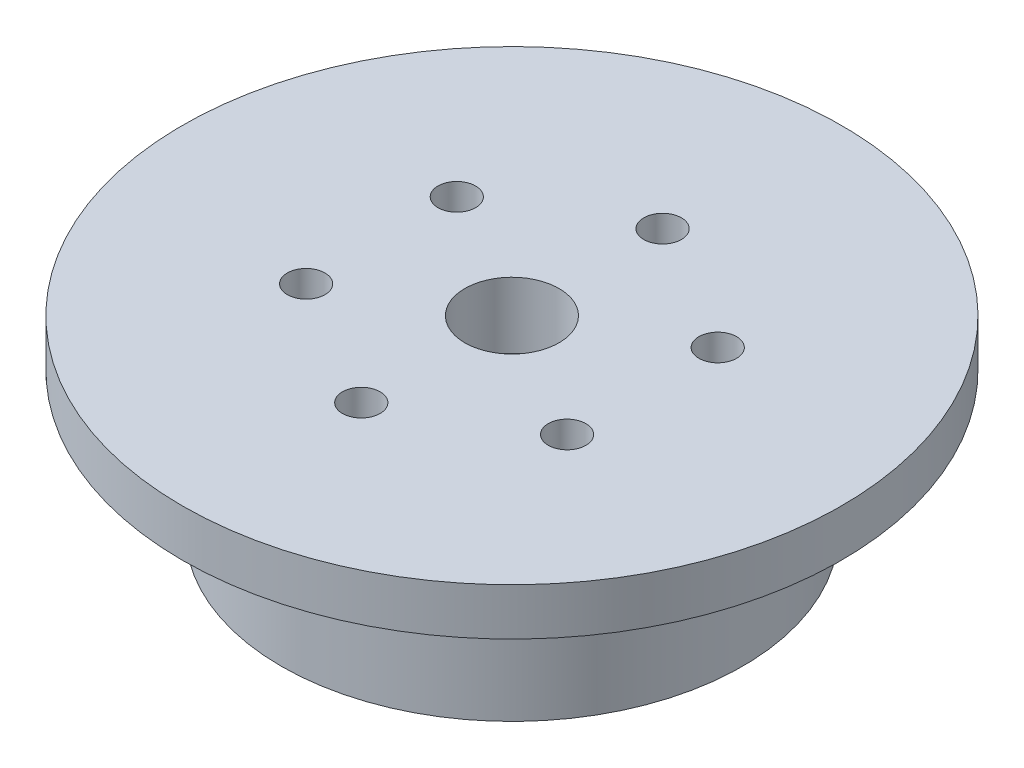
ISO-10303-21;
HEADER;
FILE_DESCRIPTION(('STEP AP214'),'2;1');
FILE_NAME('part.step','',(''),(''),'','','');
FILE_SCHEMA(('AUTOMOTIVE_DESIGN { 1 0 10303 214 1 1 1 1 }'));
ENDSEC;
DATA;
#1=APPLICATION_CONTEXT('core data for automotive mechanical design processes');
#2=APPLICATION_PROTOCOL_DEFINITION('international standard','automotive_design',2000,#1);
#3=PRODUCT_CONTEXT('',#1,'mechanical');
#4=PRODUCT('Part','Part','',(#3));
#5=PRODUCT_RELATED_PRODUCT_CATEGORY('part','',(#4));
#6=PRODUCT_DEFINITION_FORMATION('','',#4);
#7=PRODUCT_DEFINITION_CONTEXT('part definition',#1,'design');
#8=PRODUCT_DEFINITION('design','',#6,#7);
#9=PRODUCT_DEFINITION_SHAPE('','',#8);
#10=(LENGTH_UNIT() NAMED_UNIT(*) SI_UNIT(.MILLI.,.METRE.));
#11=(NAMED_UNIT(*) PLANE_ANGLE_UNIT() SI_UNIT($,.RADIAN.));
#12=(NAMED_UNIT(*) SI_UNIT($,.STERADIAN.) SOLID_ANGLE_UNIT());
#13=UNCERTAINTY_MEASURE_WITH_UNIT(LENGTH_MEASURE(1.E-05),#10,'distance_accuracy_value','');
#14=(GEOMETRIC_REPRESENTATION_CONTEXT(3) GLOBAL_UNCERTAINTY_ASSIGNED_CONTEXT((#13)) GLOBAL_UNIT_ASSIGNED_CONTEXT((#10,
#11,#12)) REPRESENTATION_CONTEXT('',''));
#15=CARTESIAN_POINT('',(0.,0.,0.));
#16=DIRECTION('',(0.,0.,1.));
#17=DIRECTION('',(1.,0.,0.));
#18=AXIS2_PLACEMENT_3D('',#15,#16,#17);
#19=CARTESIAN_POINT('',(0.,5.,0.));
#20=DIRECTION('',(0.,-1.,0.));
#21=DIRECTION('',(0.,0.,-1.));
#22=AXIS2_PLACEMENT_3D('',#19,#20,#21);
#23=CYLINDRICAL_SURFACE('',#22,35.);
#24=CARTESIAN_POINT('',(0.,5.,0.));
#25=DIRECTION('',(0.,1.,0.));
#26=DIRECTION('',(0.,0.,1.));
#27=AXIS2_PLACEMENT_3D('',#24,#25,#26);
#28=CIRCLE('',#27,35.);
#29=CARTESIAN_POINT('',(0.,5.,35.));
#30=VERTEX_POINT('',#29);
#31=EDGE_CURVE('E199',#30,#30,#28,.T.);
#32=ORIENTED_EDGE('',*,*,#31,.F.);
#33=EDGE_LOOP('',(#32));
#34=FACE_BOUND('',#33,.T.);
#35=CARTESIAN_POINT('',(0.,0.,0.));
#36=DIRECTION('',(0.,1.,0.));
#37=DIRECTION('',(0.,0.,1.));
#38=AXIS2_PLACEMENT_3D('',#35,#36,#37);
#39=CIRCLE('',#38,35.);
#40=CARTESIAN_POINT('',(0.,0.,35.));
#41=VERTEX_POINT('',#40);
#42=EDGE_CURVE('E196',#41,#41,#39,.T.);
#43=ORIENTED_EDGE('',*,*,#42,.T.);
#44=EDGE_LOOP('',(#43));
#45=FACE_BOUND('',#44,.T.);
#46=ADVANCED_FACE('F51',(#34,#45),#23,.T.);
#47=CARTESIAN_POINT('',(0.,5.,0.));
#48=DIRECTION('',(0.,1.,0.));
#49=DIRECTION('',(0.,0.,1.));
#50=AXIS2_PLACEMENT_3D('',#47,#48,#49);
#51=PLANE('',#50);
#52=CARTESIAN_POINT('',(0.,5.,0.));
#53=DIRECTION('',(0.,1.,0.));
#54=DIRECTION('',(0.,0.,1.));
#55=AXIS2_PLACEMENT_3D('',#52,#53,#54);
#56=CIRCLE('',#55,5.);
#57=CARTESIAN_POINT('',(0.,5.,5.));
#58=VERTEX_POINT('',#57);
#59=EDGE_CURVE('E121',#58,#58,#56,.T.);
#60=ORIENTED_EDGE('',*,*,#59,.F.);
#61=EDGE_LOOP('',(#60));
#62=FACE_BOUND('',#61,.T.);
#63=CARTESIAN_POINT('',(13.8564064605509,5.,-8.00000000000016));
#64=DIRECTION('',(0.,1.,0.));
#65=DIRECTION('',(-0.866025403784433,0.,0.50000000000001));
#66=AXIS2_PLACEMENT_3D('',#63,#64,#65);
#67=CIRCLE('',#66,2.);
#68=CARTESIAN_POINT('',(12.1243556529821,5.,-7.00000000000014));
#69=VERTEX_POINT('',#68);
#70=EDGE_CURVE('E141',#69,#69,#67,.T.);
#71=ORIENTED_EDGE('',*,*,#70,.F.);
#72=EDGE_LOOP('',(#71));
#73=FACE_BOUND('',#72,.T.);
#74=CARTESIAN_POINT('',(13.8564064605511,5.,7.99999999999987));
#75=DIRECTION('',(0.,1.,0.));
#76=DIRECTION('',(-0.866025403784443,0.,-0.499999999999992));
#77=AXIS2_PLACEMENT_3D('',#74,#75,#76);
#78=CIRCLE('',#77,2.);
#79=CARTESIAN_POINT('',(12.1243556529822,5.,6.99999999999989));
#80=VERTEX_POINT('',#79);
#81=EDGE_CURVE('E160',#80,#80,#78,.T.);
#82=ORIENTED_EDGE('',*,*,#81,.F.);
#83=EDGE_LOOP('',(#82));
#84=FACE_BOUND('',#83,.T.);
#85=CARTESIAN_POINT('',(0.,5.,16.));
#86=DIRECTION('',(0.,1.,0.));
#87=DIRECTION('',(0.,0.,-1.));
#88=AXIS2_PLACEMENT_3D('',#85,#86,#87);
#89=CIRCLE('',#88,2.);
#90=CARTESIAN_POINT('',(0.,5.,14.));
#91=VERTEX_POINT('',#90);
#92=EDGE_CURVE('E152',#91,#91,#89,.T.);
#93=ORIENTED_EDGE('',*,*,#92,.F.);
#94=EDGE_LOOP('',(#93));
#95=FACE_BOUND('',#94,.T.);
#96=CARTESIAN_POINT('',(-13.856406460551,5.,8.00000000000007));
#97=DIRECTION('',(0.,1.,0.));
#98=DIRECTION('',(0.866025403784436,0.,-0.500000000000004));
#99=AXIS2_PLACEMENT_3D('',#96,#97,#98);
#100=CIRCLE('',#99,2.);
#101=CARTESIAN_POINT('',(-12.1243556529821,5.,7.00000000000006));
#102=VERTEX_POINT('',#101);
#103=EDGE_CURVE('E142',#102,#102,#100,.T.);
#104=ORIENTED_EDGE('',*,*,#103,.F.);
#105=EDGE_LOOP('',(#104));
#106=FACE_BOUND('',#105,.T.);
#107=CARTESIAN_POINT('',(-13.856406460551,5.,-7.99999999999997));
#108=DIRECTION('',(0.,1.,0.));
#109=DIRECTION('',(0.86602540378444,0.,0.499999999999998));
#110=AXIS2_PLACEMENT_3D('',#107,#108,#109);
#111=CIRCLE('',#110,2.);
#112=CARTESIAN_POINT('',(-12.1243556529822,5.,-6.99999999999997));
#113=VERTEX_POINT('',#112);
#114=EDGE_CURVE('E151',#113,#113,#111,.T.);
#115=ORIENTED_EDGE('',*,*,#114,.F.);
#116=EDGE_LOOP('',(#115));
#117=FACE_BOUND('',#116,.T.);
#118=CARTESIAN_POINT('',(0.,5.,-16.));
#119=DIRECTION('',(0.,1.,0.));
#120=DIRECTION('',(0.,0.,1.));
#121=AXIS2_PLACEMENT_3D('',#118,#119,#120);
#122=CIRCLE('',#121,2.);
#123=CARTESIAN_POINT('',(0.,5.,-14.));
#124=VERTEX_POINT('',#123);
#125=EDGE_CURVE('E181',#124,#124,#122,.T.);
#126=ORIENTED_EDGE('',*,*,#125,.F.);
#127=EDGE_LOOP('',(#126));
#128=FACE_BOUND('',#127,.T.);
#129=ORIENTED_EDGE('',*,*,#31,.T.);
#130=EDGE_LOOP('',(#129));
#131=FACE_BOUND('',#130,.T.);
#132=ADVANCED_FACE('F212',(#62,#73,#84,#95,#106,#117,#128,#131),#51,.T.);
#133=CARTESIAN_POINT('',(0.,0.,0.));
#134=DIRECTION('',(0.,1.,0.));
#135=DIRECTION('',(0.,0.,1.));
#136=AXIS2_PLACEMENT_3D('',#133,#134,#135);
#137=PLANE('',#136);
#138=CARTESIAN_POINT('',(0.,0.,0.));
#139=DIRECTION('',(0.,-1.,0.));
#140=DIRECTION('',(0.,0.,-1.));
#141=AXIS2_PLACEMENT_3D('',#138,#139,#140);
#142=CIRCLE('',#141,24.5);
#143=CARTESIAN_POINT('',(0.,0.,-24.5));
#144=VERTEX_POINT('',#143);
#145=EDGE_CURVE('E192',#144,#144,#142,.T.);
#146=ORIENTED_EDGE('',*,*,#145,.F.);
#147=EDGE_LOOP('',(#146));
#148=FACE_BOUND('',#147,.T.);
#149=ORIENTED_EDGE('',*,*,#42,.F.);
#150=EDGE_LOOP('',(#149));
#151=FACE_BOUND('',#150,.T.);
#152=ADVANCED_FACE('F209',(#148,#151),#137,.F.);
#153=CARTESIAN_POINT('',(0.,-15.,0.));
#154=DIRECTION('',(0.,1.,0.));
#155=DIRECTION('',(0.,0.,1.));
#156=AXIS2_PLACEMENT_3D('',#153,#154,#155);
#157=CYLINDRICAL_SURFACE('',#156,24.5);
#158=CARTESIAN_POINT('',(0.,-15.,0.));
#159=DIRECTION('',(0.,-1.,0.));
#160=DIRECTION('',(0.,0.,-1.));
#161=AXIS2_PLACEMENT_3D('',#158,#159,#160);
#162=CIRCLE('',#161,24.5);
#163=CARTESIAN_POINT('',(0.,-15.,-24.5));
#164=VERTEX_POINT('',#163);
#165=EDGE_CURVE('E186',#164,#164,#162,.T.);
#166=ORIENTED_EDGE('',*,*,#165,.F.);
#167=EDGE_LOOP('',(#166));
#168=FACE_BOUND('',#167,.T.);
#169=ORIENTED_EDGE('',*,*,#145,.T.);
#170=EDGE_LOOP('',(#169));
#171=FACE_BOUND('',#170,.T.);
#172=ADVANCED_FACE('F211',(#168,#171),#157,.T.);
#173=CARTESIAN_POINT('',(0.,-15.,0.));
#174=DIRECTION('',(0.,-1.,0.));
#175=DIRECTION('',(0.,0.,-1.));
#176=AXIS2_PLACEMENT_3D('',#173,#174,#175);
#177=PLANE('',#176);
#178=DIRECTION('',(-1.,0.,0.));
#179=VECTOR('',#178,1.);
#180=CARTESIAN_POINT('',(0.,-15.,2.5));
#181=LINE('',#180,#179);
#182=CARTESIAN_POINT('',(-6.37749950999606,-15.,2.5));
#183=VERTEX_POINT('',#182);
#184=CARTESIAN_POINT('',(-9.35,-15.,2.5));
#185=VERTEX_POINT('',#184);
#186=EDGE_CURVE('E75',#183,#185,#181,.T.);
#187=ORIENTED_EDGE('',*,*,#186,.F.);
#188=CARTESIAN_POINT('',(0.,-15.,0.));
#189=DIRECTION('',(0.,-1.,0.));
#190=DIRECTION('',(0.,0.,-1.));
#191=AXIS2_PLACEMENT_3D('',#188,#189,#190);
#192=CIRCLE('',#191,6.85);
#193=CARTESIAN_POINT('',(-6.37749950999606,-15.,-2.5));
#194=VERTEX_POINT('',#193);
#195=EDGE_CURVE('E60',#194,#183,#192,.T.);
#196=ORIENTED_EDGE('',*,*,#195,.F.);
#197=DIRECTION('',(1.,0.,0.));
#198=VECTOR('',#197,1.);
#199=CARTESIAN_POINT('',(0.,-15.,-2.5));
#200=LINE('',#199,#198);
#201=CARTESIAN_POINT('',(-9.35,-15.,-2.5));
#202=VERTEX_POINT('',#201);
#203=EDGE_CURVE('E136',#202,#194,#200,.T.);
#204=ORIENTED_EDGE('',*,*,#203,.F.);
#205=DIRECTION('',(0.,0.,-1.));
#206=VECTOR('',#205,1.);
#207=CARTESIAN_POINT('',(-9.35,-15.,0.));
#208=LINE('',#207,#206);
#209=EDGE_CURVE('E12',#185,#202,#208,.T.);
#210=ORIENTED_EDGE('',*,*,#209,.F.);
#211=EDGE_LOOP('',(#187,#196,#204,#210));
#212=FACE_BOUND('',#211,.T.);
#213=ORIENTED_EDGE('',*,*,#165,.T.);
#214=EDGE_LOOP('',(#213));
#215=FACE_BOUND('',#214,.T.);
#216=ADVANCED_FACE('F218',(#212,#215),#177,.T.);
#217=CARTESIAN_POINT('',(0.,-5.,-16.));
#218=DIRECTION('',(0.,1.,0.));
#219=DIRECTION('',(0.,0.,1.));
#220=AXIS2_PLACEMENT_3D('',#217,#218,#219);
#221=CYLINDRICAL_SURFACE('',#220,2.);
#222=CARTESIAN_POINT('',(0.,-5.,-16.));
#223=DIRECTION('',(0.,1.,0.));
#224=DIRECTION('',(0.,0.,1.));
#225=AXIS2_PLACEMENT_3D('',#222,#223,#224);
#226=CIRCLE('',#225,2.);
#227=CARTESIAN_POINT('',(0.,-5.,-14.));
#228=VERTEX_POINT('',#227);
#229=EDGE_CURVE('E182',#228,#228,#226,.T.);
#230=ORIENTED_EDGE('',*,*,#229,.F.);
#231=EDGE_LOOP('',(#230));
#232=FACE_BOUND('',#231,.T.);
#233=ORIENTED_EDGE('',*,*,#125,.T.);
#234=EDGE_LOOP('',(#233));
#235=FACE_BOUND('',#234,.T.);
#236=ADVANCED_FACE('F251',(#232,#235),#221,.F.);
#237=CARTESIAN_POINT('',(0.,-5.,-16.));
#238=DIRECTION('',(0.,1.,0.));
#239=DIRECTION('',(0.,0.,1.));
#240=AXIS2_PLACEMENT_3D('',#237,#238,#239);
#241=PLANE('',#240);
#242=ORIENTED_EDGE('',*,*,#229,.T.);
#243=EDGE_LOOP('',(#242));
#244=FACE_BOUND('',#243,.T.);
#245=ADVANCED_FACE('F261',(#244),#241,.T.);
#246=CARTESIAN_POINT('',(-13.856406460551,-5.,-7.99999999999997));
#247=DIRECTION('',(0.,1.,0.));
#248=DIRECTION('',(0.86602540378444,0.,0.499999999999998));
#249=AXIS2_PLACEMENT_3D('',#246,#247,#248);
#250=CYLINDRICAL_SURFACE('',#249,2.);
#251=CARTESIAN_POINT('',(-13.856406460551,-5.,-7.99999999999997));
#252=DIRECTION('',(0.,1.,0.));
#253=DIRECTION('',(0.86602540378444,0.,0.499999999999998));
#254=AXIS2_PLACEMENT_3D('',#251,#252,#253);
#255=CIRCLE('',#254,2.);
#256=CARTESIAN_POINT('',(-12.1243556529822,-5.,-6.99999999999997));
#257=VERTEX_POINT('',#256);
#258=EDGE_CURVE('E177',#257,#257,#255,.T.);
#259=ORIENTED_EDGE('',*,*,#258,.F.);
#260=EDGE_LOOP('',(#259));
#261=FACE_BOUND('',#260,.T.);
#262=ORIENTED_EDGE('',*,*,#114,.T.);
#263=EDGE_LOOP('',(#262));
#264=FACE_BOUND('',#263,.T.);
#265=ADVANCED_FACE('F270',(#261,#264),#250,.F.);
#266=CARTESIAN_POINT('',(-13.856406460551,-5.,-7.99999999999997));
#267=DIRECTION('',(0.,1.,0.));
#268=DIRECTION('',(0.86602540378444,0.,0.499999999999998));
#269=AXIS2_PLACEMENT_3D('',#266,#267,#268);
#270=PLANE('',#269);
#271=ORIENTED_EDGE('',*,*,#258,.T.);
#272=EDGE_LOOP('',(#271));
#273=FACE_BOUND('',#272,.T.);
#274=ADVANCED_FACE('F279',(#273),#270,.T.);
#275=CARTESIAN_POINT('',(-13.856406460551,-5.,8.00000000000007));
#276=DIRECTION('',(0.,1.,0.));
#277=DIRECTION('',(0.866025403784436,0.,-0.500000000000004));
#278=AXIS2_PLACEMENT_3D('',#275,#276,#277);
#279=CYLINDRICAL_SURFACE('',#278,2.);
#280=CARTESIAN_POINT('',(-13.856406460551,-5.,8.00000000000007));
#281=DIRECTION('',(0.,1.,0.));
#282=DIRECTION('',(0.866025403784436,0.,-0.500000000000004));
#283=AXIS2_PLACEMENT_3D('',#280,#281,#282);
#284=CIRCLE('',#283,2.);
#285=CARTESIAN_POINT('',(-12.1243556529821,-5.,7.00000000000006));
#286=VERTEX_POINT('',#285);
#287=EDGE_CURVE('E146',#286,#286,#284,.T.);
#288=ORIENTED_EDGE('',*,*,#287,.F.);
#289=EDGE_LOOP('',(#288));
#290=FACE_BOUND('',#289,.T.);
#291=ORIENTED_EDGE('',*,*,#103,.T.);
#292=EDGE_LOOP('',(#291));
#293=FACE_BOUND('',#292,.T.);
#294=ADVANCED_FACE('F288',(#290,#293),#279,.F.);
#295=CARTESIAN_POINT('',(-13.856406460551,-5.,8.00000000000007));
#296=DIRECTION('',(0.,1.,0.));
#297=DIRECTION('',(0.866025403784436,0.,-0.500000000000004));
#298=AXIS2_PLACEMENT_3D('',#295,#296,#297);
#299=PLANE('',#298);
#300=ORIENTED_EDGE('',*,*,#287,.T.);
#301=EDGE_LOOP('',(#300));
#302=FACE_BOUND('',#301,.T.);
#303=ADVANCED_FACE('F297',(#302),#299,.T.);
#304=CARTESIAN_POINT('',(0.,-5.,16.));
#305=DIRECTION('',(0.,1.,0.));
#306=DIRECTION('',(0.,0.,-1.));
#307=AXIS2_PLACEMENT_3D('',#304,#305,#306);
#308=CYLINDRICAL_SURFACE('',#307,2.);
#309=CARTESIAN_POINT('',(0.,-5.,16.));
#310=DIRECTION('',(0.,1.,0.));
#311=DIRECTION('',(0.,0.,-1.));
#312=AXIS2_PLACEMENT_3D('',#309,#310,#311);
#313=CIRCLE('',#312,2.);
#314=CARTESIAN_POINT('',(0.,-5.,14.));
#315=VERTEX_POINT('',#314);
#316=EDGE_CURVE('E147',#315,#315,#313,.T.);
#317=ORIENTED_EDGE('',*,*,#316,.F.);
#318=EDGE_LOOP('',(#317));
#319=FACE_BOUND('',#318,.T.);
#320=ORIENTED_EDGE('',*,*,#92,.T.);
#321=EDGE_LOOP('',(#320));
#322=FACE_BOUND('',#321,.T.);
#323=ADVANCED_FACE('F306',(#319,#322),#308,.F.);
#324=CARTESIAN_POINT('',(0.,-5.,16.));
#325=DIRECTION('',(0.,1.,0.));
#326=DIRECTION('',(0.,0.,-1.));
#327=AXIS2_PLACEMENT_3D('',#324,#325,#326);
#328=PLANE('',#327);
#329=ORIENTED_EDGE('',*,*,#316,.T.);
#330=EDGE_LOOP('',(#329));
#331=FACE_BOUND('',#330,.T.);
#332=ADVANCED_FACE('F315',(#331),#328,.T.);
#333=CARTESIAN_POINT('',(13.8564064605511,-5.,7.99999999999987));
#334=DIRECTION('',(0.,1.,0.));
#335=DIRECTION('',(-0.866025403784443,0.,-0.499999999999992));
#336=AXIS2_PLACEMENT_3D('',#333,#334,#335);
#337=CYLINDRICAL_SURFACE('',#336,2.);
#338=CARTESIAN_POINT('',(13.8564064605511,-5.,7.99999999999987));
#339=DIRECTION('',(0.,1.,0.));
#340=DIRECTION('',(-0.866025403784443,0.,-0.499999999999992));
#341=AXIS2_PLACEMENT_3D('',#338,#339,#340);
#342=CIRCLE('',#341,2.);
#343=CARTESIAN_POINT('',(12.1243556529822,-5.,6.99999999999989));
#344=VERTEX_POINT('',#343);
#345=EDGE_CURVE('E156',#344,#344,#342,.T.);
#346=ORIENTED_EDGE('',*,*,#345,.F.);
#347=EDGE_LOOP('',(#346));
#348=FACE_BOUND('',#347,.T.);
#349=ORIENTED_EDGE('',*,*,#81,.T.);
#350=EDGE_LOOP('',(#349));
#351=FACE_BOUND('',#350,.T.);
#352=ADVANCED_FACE('F324',(#348,#351),#337,.F.);
#353=CARTESIAN_POINT('',(13.8564064605511,-5.,7.99999999999987));
#354=DIRECTION('',(0.,1.,0.));
#355=DIRECTION('',(-0.866025403784443,0.,-0.499999999999992));
#356=AXIS2_PLACEMENT_3D('',#353,#354,#355);
#357=PLANE('',#356);
#358=ORIENTED_EDGE('',*,*,#345,.T.);
#359=EDGE_LOOP('',(#358));
#360=FACE_BOUND('',#359,.T.);
#361=ADVANCED_FACE('F333',(#360),#357,.T.);
#362=CARTESIAN_POINT('',(13.8564064605509,-5.,-8.00000000000016));
#363=DIRECTION('',(0.,1.,0.));
#364=DIRECTION('',(-0.866025403784433,0.,0.50000000000001));
#365=AXIS2_PLACEMENT_3D('',#362,#363,#364);
#366=CYLINDRICAL_SURFACE('',#365,2.);
#367=CARTESIAN_POINT('',(13.8564064605509,-5.,-8.00000000000016));
#368=DIRECTION('',(0.,1.,0.));
#369=DIRECTION('',(-0.866025403784433,0.,0.50000000000001));
#370=AXIS2_PLACEMENT_3D('',#367,#368,#369);
#371=CIRCLE('',#370,2.);
#372=CARTESIAN_POINT('',(12.1243556529821,-5.,-7.00000000000014));
#373=VERTEX_POINT('',#372);
#374=EDGE_CURVE('E164',#373,#373,#371,.T.);
#375=ORIENTED_EDGE('',*,*,#374,.F.);
#376=EDGE_LOOP('',(#375));
#377=FACE_BOUND('',#376,.T.);
#378=ORIENTED_EDGE('',*,*,#70,.T.);
#379=EDGE_LOOP('',(#378));
#380=FACE_BOUND('',#379,.T.);
#381=ADVANCED_FACE('F342',(#377,#380),#366,.F.);
#382=CARTESIAN_POINT('',(13.8564064605509,-5.,-8.00000000000016));
#383=DIRECTION('',(0.,1.,0.));
#384=DIRECTION('',(-0.866025403784433,0.,0.50000000000001));
#385=AXIS2_PLACEMENT_3D('',#382,#383,#384);
#386=PLANE('',#385);
#387=ORIENTED_EDGE('',*,*,#374,.T.);
#388=EDGE_LOOP('',(#387));
#389=FACE_BOUND('',#388,.T.);
#390=ADVANCED_FACE('F351',(#389),#386,.T.);
#391=CARTESIAN_POINT('',(0.,-5.,0.));
#392=DIRECTION('',(0.,1.,0.));
#393=DIRECTION('',(0.,0.,1.));
#394=AXIS2_PLACEMENT_3D('',#391,#392,#393);
#395=PLANE('',#394);
#396=CARTESIAN_POINT('',(0.,-5.,0.));
#397=DIRECTION('',(0.,1.,0.));
#398=DIRECTION('',(0.,0.,1.));
#399=AXIS2_PLACEMENT_3D('',#396,#397,#398);
#400=CIRCLE('',#399,3.);
#401=CARTESIAN_POINT('',(0.,-5.,3.));
#402=VERTEX_POINT('',#401);
#403=EDGE_CURVE('E54',#402,#402,#400,.T.);
#404=ORIENTED_EDGE('',*,*,#403,.T.);
#405=EDGE_LOOP('',(#404));
#406=FACE_BOUND('',#405,.T.);
#407=CARTESIAN_POINT('',(0.,-5.,0.));
#408=DIRECTION('',(0.,1.,0.));
#409=DIRECTION('',(0.,0.,1.));
#410=AXIS2_PLACEMENT_3D('',#407,#408,#409);
#411=CIRCLE('',#410,6.85);
#412=CARTESIAN_POINT('',(-6.37749950999606,-5.,-2.5));
#413=VERTEX_POINT('',#412);
#414=CARTESIAN_POINT('',(-6.37749950999606,-5.,2.5));
#415=VERTEX_POINT('',#414);
#416=EDGE_CURVE('E111',#413,#415,#411,.F.);
#417=ORIENTED_EDGE('',*,*,#416,.T.);
#418=DIRECTION('',(-1.,0.,0.));
#419=VECTOR('',#418,1.);
#420=CARTESIAN_POINT('',(-6.37749950999606,-5.,2.5));
#421=LINE('',#420,#419);
#422=CARTESIAN_POINT('',(-9.35,-5.,2.5));
#423=VERTEX_POINT('',#422);
#424=EDGE_CURVE('E106',#415,#423,#421,.T.);
#425=ORIENTED_EDGE('',*,*,#424,.T.);
#426=DIRECTION('',(0.,0.,-1.));
#427=VECTOR('',#426,1.);
#428=CARTESIAN_POINT('',(-9.35,-5.,2.5));
#429=LINE('',#428,#427);
#430=CARTESIAN_POINT('',(-9.35,-5.,-2.5));
#431=VERTEX_POINT('',#430);
#432=EDGE_CURVE('E94',#423,#431,#429,.T.);
#433=ORIENTED_EDGE('',*,*,#432,.T.);
#434=DIRECTION('',(1.,0.,0.));
#435=VECTOR('',#434,1.);
#436=CARTESIAN_POINT('',(-6.37749950999606,-5.,-2.5));
#437=LINE('',#436,#435);
#438=EDGE_CURVE('E128',#431,#413,#437,.T.);
#439=ORIENTED_EDGE('',*,*,#438,.T.);
#440=EDGE_LOOP('',(#417,#425,#433,#439));
#441=FACE_BOUND('',#440,.T.);
#442=ADVANCED_FACE('F110',(#406,#441),#395,.F.);
#443=CARTESIAN_POINT('',(-6.37749950999606,26.2162673437153,2.5));
#444=DIRECTION('',(0.,0.,1.));
#445=DIRECTION('',(1.,0.,0.));
#446=AXIS2_PLACEMENT_3D('',#443,#444,#445);
#447=PLANE('',#446);
#448=ORIENTED_EDGE('',*,*,#186,.T.);
#449=DIRECTION('',(0.,-1.,0.));
#450=VECTOR('',#449,1.);
#451=CARTESIAN_POINT('',(-9.35,26.2162673437153,2.5));
#452=LINE('',#451,#450);
#453=EDGE_CURVE('E96',#423,#185,#452,.T.);
#454=ORIENTED_EDGE('',*,*,#453,.F.);
#455=ORIENTED_EDGE('',*,*,#424,.F.);
#456=DIRECTION('',(0.,-1.,0.));
#457=VECTOR('',#456,1.);
#458=CARTESIAN_POINT('',(-6.37749950999606,26.2162673437153,2.5));
#459=LINE('',#458,#457);
#460=EDGE_CURVE('E127',#415,#183,#459,.T.);
#461=ORIENTED_EDGE('',*,*,#460,.T.);
#462=EDGE_LOOP('',(#448,#454,#455,#461));
#463=FACE_BOUND('',#462,.T.);
#464=ADVANCED_FACE('F105',(#463),#447,.F.);
#465=CARTESIAN_POINT('',(-9.35,26.2162673437153,2.5));
#466=DIRECTION('',(-1.,0.,0.));
#467=DIRECTION('',(0.,0.,1.));
#468=AXIS2_PLACEMENT_3D('',#465,#466,#467);
#469=PLANE('',#468);
#470=ORIENTED_EDGE('',*,*,#209,.T.);
#471=DIRECTION('',(0.,-1.,0.));
#472=VECTOR('',#471,1.);
#473=CARTESIAN_POINT('',(-9.35,26.2162673437153,-2.5));
#474=LINE('',#473,#472);
#475=EDGE_CURVE('E99',#431,#202,#474,.T.);
#476=ORIENTED_EDGE('',*,*,#475,.F.);
#477=ORIENTED_EDGE('',*,*,#432,.F.);
#478=ORIENTED_EDGE('',*,*,#453,.T.);
#479=EDGE_LOOP('',(#470,#476,#477,#478));
#480=FACE_BOUND('',#479,.T.);
#481=ADVANCED_FACE('F95',(#480),#469,.F.);
#482=CARTESIAN_POINT('',(-6.37749950999606,26.2162673437153,-2.5));
#483=DIRECTION('',(0.,0.,-1.));
#484=DIRECTION('',(-1.,0.,0.));
#485=AXIS2_PLACEMENT_3D('',#482,#483,#484);
#486=PLANE('',#485);
#487=ORIENTED_EDGE('',*,*,#203,.T.);
#488=DIRECTION('',(0.,-1.,0.));
#489=VECTOR('',#488,1.);
#490=CARTESIAN_POINT('',(-6.37749950999606,26.2162673437153,-2.5));
#491=LINE('',#490,#489);
#492=EDGE_CURVE('E67',#413,#194,#491,.T.);
#493=ORIENTED_EDGE('',*,*,#492,.F.);
#494=ORIENTED_EDGE('',*,*,#438,.F.);
#495=ORIENTED_EDGE('',*,*,#475,.T.);
#496=EDGE_LOOP('',(#487,#493,#494,#495));
#497=FACE_BOUND('',#496,.T.);
#498=ADVANCED_FACE('F382',(#497),#486,.F.);
#499=CARTESIAN_POINT('',(0.,26.2162673437153,0.));
#500=DIRECTION('',(0.,-1.,0.));
#501=DIRECTION('',(0.,0.,-1.));
#502=AXIS2_PLACEMENT_3D('',#499,#500,#501);
#503=CYLINDRICAL_SURFACE('',#502,6.85);
#504=ORIENTED_EDGE('',*,*,#195,.T.);
#505=ORIENTED_EDGE('',*,*,#460,.F.);
#506=ORIENTED_EDGE('',*,*,#416,.F.);
#507=ORIENTED_EDGE('',*,*,#492,.T.);
#508=EDGE_LOOP('',(#504,#505,#506,#507));
#509=FACE_BOUND('',#508,.T.);
#510=ADVANCED_FACE('F390',(#509),#503,.F.);
#511=CARTESIAN_POINT('',(0.,-2.,0.));
#512=DIRECTION('',(0.,1.,0.));
#513=DIRECTION('',(0.,0.,1.));
#514=AXIS2_PLACEMENT_3D('',#511,#512,#513);
#515=CYLINDRICAL_SURFACE('',#514,5.);
#516=CARTESIAN_POINT('',(0.,-2.,0.));
#517=DIRECTION('',(0.,1.,0.));
#518=DIRECTION('',(0.,0.,1.));
#519=AXIS2_PLACEMENT_3D('',#516,#517,#518);
#520=CIRCLE('',#519,5.);
#521=CARTESIAN_POINT('',(0.,-2.,5.));
#522=VERTEX_POINT('',#521);
#523=EDGE_CURVE('E114',#522,#522,#520,.T.);
#524=ORIENTED_EDGE('',*,*,#523,.F.);
#525=EDGE_LOOP('',(#524));
#526=FACE_BOUND('',#525,.T.);
#527=ORIENTED_EDGE('',*,*,#59,.T.);
#528=EDGE_LOOP('',(#527));
#529=FACE_BOUND('',#528,.T.);
#530=ADVANCED_FACE('F398',(#526,#529),#515,.F.);
#531=CARTESIAN_POINT('',(0.,-2.,0.));
#532=DIRECTION('',(0.,1.,0.));
#533=DIRECTION('',(0.,0.,1.));
#534=AXIS2_PLACEMENT_3D('',#531,#532,#533);
#535=PLANE('',#534);
#536=CARTESIAN_POINT('',(0.,-2.,0.));
#537=DIRECTION('',(0.,1.,0.));
#538=DIRECTION('',(0.,0.,1.));
#539=AXIS2_PLACEMENT_3D('',#536,#537,#538);
#540=CIRCLE('',#539,3.);
#541=CARTESIAN_POINT('',(0.,-2.,3.));
#542=VERTEX_POINT('',#541);
#543=EDGE_CURVE('E534',#542,#542,#540,.T.);
#544=ORIENTED_EDGE('',*,*,#543,.F.);
#545=EDGE_LOOP('',(#544));
#546=FACE_BOUND('',#545,.T.);
#547=ORIENTED_EDGE('',*,*,#523,.T.);
#548=EDGE_LOOP('',(#547));
#549=FACE_BOUND('',#548,.T.);
#550=ADVANCED_FACE('F405',(#546,#549),#535,.T.);
#551=CARTESIAN_POINT('',(0.,-15.,0.));
#552=DIRECTION('',(0.,1.,0.));
#553=DIRECTION('',(0.,0.,1.));
#554=AXIS2_PLACEMENT_3D('',#551,#552,#553);
#555=CYLINDRICAL_SURFACE('',#554,3.);
#556=CARTESIAN_POINT('',(0.,-2.,3.));
#557=CARTESIAN_POINT('',(0.,-2.03125,3.));
#558=CARTESIAN_POINT('',(0.,-2.0625,3.));
#559=CARTESIAN_POINT('',(0.,-2.125,3.));
#560=CARTESIAN_POINT('',(0.,-2.15625,3.));
#561=CARTESIAN_POINT('',(0.,-2.21875,3.));
#562=CARTESIAN_POINT('',(0.,-2.25,3.));
#563=CARTESIAN_POINT('',(0.,-2.3125,3.));
#564=CARTESIAN_POINT('',(0.,-2.34375,3.));
#565=CARTESIAN_POINT('',(0.,-2.40625,3.));
#566=CARTESIAN_POINT('',(0.,-2.4375,3.));
#567=CARTESIAN_POINT('',(0.,-2.5,3.));
#568=CARTESIAN_POINT('',(0.,-2.53125,3.));
#569=CARTESIAN_POINT('',(0.,-2.59375,3.));
#570=CARTESIAN_POINT('',(0.,-2.625,3.));
#571=CARTESIAN_POINT('',(0.,-2.6875,3.));
#572=CARTESIAN_POINT('',(0.,-2.71875,3.));
#573=CARTESIAN_POINT('',(0.,-2.78125,3.));
#574=CARTESIAN_POINT('',(0.,-2.8125,3.));
#575=CARTESIAN_POINT('',(0.,-2.875,3.));
#576=CARTESIAN_POINT('',(0.,-2.90625,3.));
#577=CARTESIAN_POINT('',(0.,-2.96875,3.));
#578=CARTESIAN_POINT('',(0.,-3.,3.));
#579=CARTESIAN_POINT('',(0.,-3.0625,3.));
#580=CARTESIAN_POINT('',(0.,-3.09375,3.));
#581=CARTESIAN_POINT('',(0.,-3.15625,3.));
#582=CARTESIAN_POINT('',(0.,-3.1875,3.));
#583=CARTESIAN_POINT('',(0.,-3.25,3.));
#584=CARTESIAN_POINT('',(0.,-3.28125,3.));
#585=CARTESIAN_POINT('',(0.,-3.34375,3.));
#586=CARTESIAN_POINT('',(0.,-3.375,3.));
#587=CARTESIAN_POINT('',(0.,-3.4375,3.));
#588=CARTESIAN_POINT('',(0.,-3.46875,3.));
#589=CARTESIAN_POINT('',(0.,-3.53125,3.));
#590=CARTESIAN_POINT('',(0.,-3.5625,3.));
#591=CARTESIAN_POINT('',(0.,-3.625,3.));
#592=CARTESIAN_POINT('',(0.,-3.65625,3.));
#593=CARTESIAN_POINT('',(0.,-3.71875,3.));
#594=CARTESIAN_POINT('',(0.,-3.75,3.));
#595=CARTESIAN_POINT('',(0.,-3.8125,3.));
#596=CARTESIAN_POINT('',(0.,-3.84375,3.));
#597=CARTESIAN_POINT('',(0.,-3.90625,3.));
#598=CARTESIAN_POINT('',(0.,-3.9375,3.));
#599=CARTESIAN_POINT('',(0.,-4.,3.));
#600=CARTESIAN_POINT('',(0.,-4.03125,3.));
#601=CARTESIAN_POINT('',(0.,-4.09375,3.));
#602=CARTESIAN_POINT('',(0.,-4.125,3.));
#603=CARTESIAN_POINT('',(0.,-4.1875,3.));
#604=CARTESIAN_POINT('',(0.,-4.21875,3.));
#605=CARTESIAN_POINT('',(0.,-4.28125,3.));
#606=CARTESIAN_POINT('',(0.,-4.3125,3.));
#607=CARTESIAN_POINT('',(0.,-4.375,3.));
#608=CARTESIAN_POINT('',(0.,-4.40625,3.));
#609=CARTESIAN_POINT('',(0.,-4.46875,3.));
#610=CARTESIAN_POINT('',(0.,-4.5,3.));
#611=CARTESIAN_POINT('',(0.,-4.5625,3.));
#612=CARTESIAN_POINT('',(0.,-4.59375,3.));
#613=CARTESIAN_POINT('',(0.,-4.65625,3.));
#614=CARTESIAN_POINT('',(0.,-4.6875,3.));
#615=CARTESIAN_POINT('',(0.,-4.75,3.));
#616=CARTESIAN_POINT('',(0.,-4.78125,3.));
#617=CARTESIAN_POINT('',(0.,-4.84375,3.));
#618=CARTESIAN_POINT('',(0.,-4.875,3.));
#619=CARTESIAN_POINT('',(0.,-4.9375,3.));
#620=CARTESIAN_POINT('',(0.,-4.96875,3.));
#621=CARTESIAN_POINT('',(0.,-5.,3.));
#622=B_SPLINE_CURVE_WITH_KNOTS('',3,(#556,#557,#558,#559,#560,#561,#562,#563,#564,#565,#566,
#567,#568,#569,#570,#571,#572,#573,#574,#575,#576,#577,#578,#579,#580,#581,#582,#583,#584,#585,
#586,#587,#588,#589,#590,#591,#592,#593,#594,#595,#596,#597,#598,#599,#600,#601,#602,#603,#604,
#605,#606,#607,#608,#609,#610,#611,#612,#613,#614,#615,#616,#617,#618,#619,#620,#621),
.UNSPECIFIED.,.F.,.F.,(4,2,2,2,2,2,2,2,2,2,2,2,2,2,2,2,2,2,2,2,2,2,2,2,2,2,2,2,2,2,2,2,4),(0.,
0.0937500000000001,0.1875,0.28125,0.375,0.46875,0.5625,0.656250000000001,0.750000000000001,
0.843750000000001,0.937500000000001,1.03125,1.125,1.21875,1.3125,1.40625,1.5,1.59375,1.6875,
1.78125,1.875,1.96875,2.0625,2.15625,2.25,2.34375,2.4375,2.53125,2.625,2.71875,2.8125,2.90625,
3.),.UNSPECIFIED.);
#623=EDGE_CURVE('BSEAM413',#542,#402,#622,.T.);
#624=ORIENTED_EDGE('',*,*,#543,.T.);
#625=ORIENTED_EDGE('',*,*,#403,.F.);
#626=ORIENTED_EDGE('',*,*,#623,.T.);
#627=ORIENTED_EDGE('',*,*,#623,.F.);
#628=EDGE_LOOP('',(#624,#626,#625,#627));
#629=FACE_BOUND('',#628,.T.);
#630=ADVANCED_FACE('F413',(#629),#555,.F.);
#631=CLOSED_SHELL('',(#46,#132,#152,#172,#216,#236,#245,#265,#274,#294,#303,#323,#332,#352,#361,
#381,#390,#442,#464,#481,#498,#510,#530,#550,#630));
#632=MANIFOLD_SOLID_BREP('B2',#631);
#633=ADVANCED_BREP_SHAPE_REPRESENTATION('',(#18,#632),#14);
#634=SHAPE_DEFINITION_REPRESENTATION(#9,#633);
ENDSEC;
END-ISO-10303-21;
